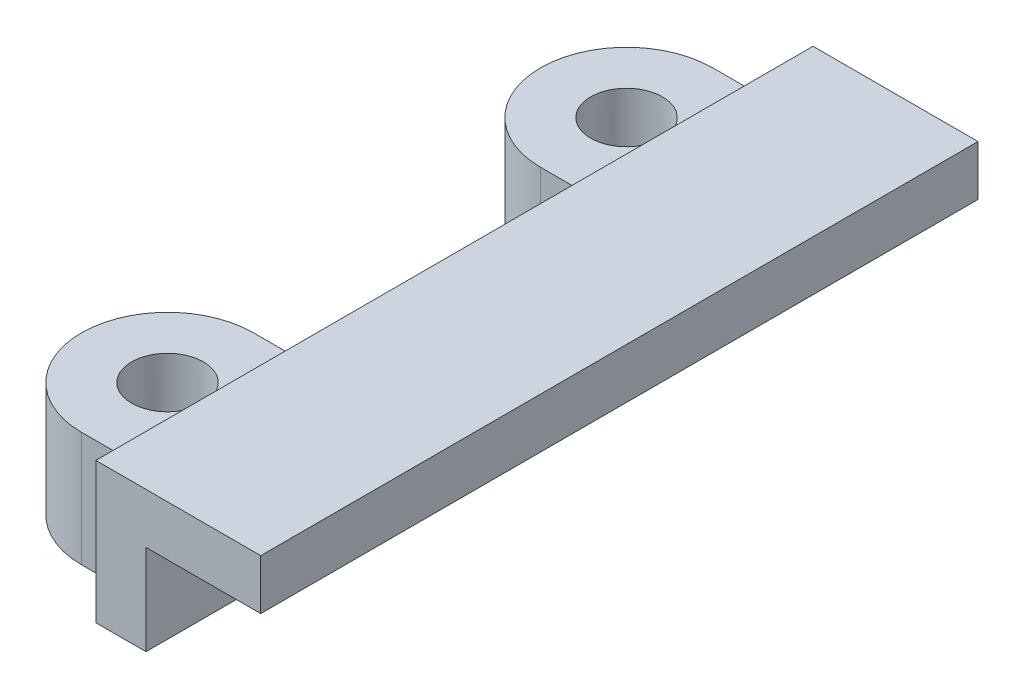
ISO-10303-21;
HEADER;
FILE_DESCRIPTION(('STEP AP214'),'2;1');
FILE_NAME('part.step','',(''),(''),'','','');
FILE_SCHEMA(('AUTOMOTIVE_DESIGN { 1 0 10303 214 1 1 1 1 }'));
ENDSEC;
DATA;
#1=APPLICATION_CONTEXT('core data for automotive mechanical design processes');
#2=APPLICATION_PROTOCOL_DEFINITION('international standard','automotive_design',2000,#1);
#3=PRODUCT_CONTEXT('',#1,'mechanical');
#4=PRODUCT('Part','Part','',(#3));
#5=PRODUCT_RELATED_PRODUCT_CATEGORY('part','',(#4));
#6=PRODUCT_DEFINITION_FORMATION('','',#4);
#7=PRODUCT_DEFINITION_CONTEXT('part definition',#1,'design');
#8=PRODUCT_DEFINITION('design','',#6,#7);
#9=PRODUCT_DEFINITION_SHAPE('','',#8);
#10=(LENGTH_UNIT() NAMED_UNIT(*) SI_UNIT(.MILLI.,.METRE.));
#11=(NAMED_UNIT(*) PLANE_ANGLE_UNIT() SI_UNIT($,.RADIAN.));
#12=(NAMED_UNIT(*) SI_UNIT($,.STERADIAN.) SOLID_ANGLE_UNIT());
#13=UNCERTAINTY_MEASURE_WITH_UNIT(LENGTH_MEASURE(1.E-05),#10,'distance_accuracy_value','');
#14=(GEOMETRIC_REPRESENTATION_CONTEXT(3) GLOBAL_UNCERTAINTY_ASSIGNED_CONTEXT((#13)) GLOBAL_UNIT_ASSIGNED_CONTEXT((#10,
#11,#12)) REPRESENTATION_CONTEXT('',''));
#15=CARTESIAN_POINT('',(0.,0.,0.));
#16=DIRECTION('',(0.,0.,1.));
#17=DIRECTION('',(1.,0.,0.));
#18=AXIS2_PLACEMENT_3D('',#15,#16,#17);
#19=CARTESIAN_POINT('',(161.,9.8,50.));
#20=DIRECTION('',(0.,0.,1.));
#21=DIRECTION('',(1.,0.,0.));
#22=AXIS2_PLACEMENT_3D('',#19,#20,#21);
#23=PLANE('',#22);
#24=DIRECTION('',(0.,1.,0.));
#25=VECTOR('',#24,1.);
#26=CARTESIAN_POINT('',(3.5,0.,50.));
#27=LINE('',#26,#25);
#28=CARTESIAN_POINT('',(3.5,0.,50.));
#29=VERTEX_POINT('',#28);
#30=CARTESIAN_POINT('',(3.5,6.3,50.));
#31=VERTEX_POINT('',#30);
#32=EDGE_CURVE('E170',#29,#31,#27,.T.);
#33=ORIENTED_EDGE('',*,*,#32,.T.);
#34=DIRECTION('',(1.,0.,0.));
#35=VECTOR('',#34,1.);
#36=CARTESIAN_POINT('',(3.5,6.3,50.));
#37=LINE('',#36,#35);
#38=CARTESIAN_POINT('',(11.5,6.3,50.));
#39=VERTEX_POINT('',#38);
#40=EDGE_CURVE('E151',#31,#39,#37,.T.);
#41=ORIENTED_EDGE('',*,*,#40,.T.);
#42=DIRECTION('',(0.,1.,0.));
#43=VECTOR('',#42,1.);
#44=CARTESIAN_POINT('',(11.5,9.8,50.));
#45=LINE('',#44,#43);
#46=CARTESIAN_POINT('',(11.5,9.8,50.));
#47=VERTEX_POINT('',#46);
#48=EDGE_CURVE('E161',#39,#47,#45,.T.);
#49=ORIENTED_EDGE('',*,*,#48,.T.);
#50=DIRECTION('',(-1.,0.,0.));
#51=VECTOR('',#50,1.);
#52=CARTESIAN_POINT('',(161.,9.8,50.));
#53=LINE('',#52,#51);
#54=CARTESIAN_POINT('',(0.,9.8,50.));
#55=VERTEX_POINT('',#54);
#56=EDGE_CURVE('E238',#47,#55,#53,.T.);
#57=ORIENTED_EDGE('',*,*,#56,.T.);
#58=DIRECTION('',(0.,1.,0.));
#59=VECTOR('',#58,1.);
#60=CARTESIAN_POINT('',(0.,9.8,50.));
#61=LINE('',#60,#59);
#62=CARTESIAN_POINT('',(0.,0.,50.));
#63=VERTEX_POINT('',#62);
#64=EDGE_CURVE('E226',#63,#55,#61,.T.);
#65=ORIENTED_EDGE('',*,*,#64,.F.);
#66=DIRECTION('',(-1.,0.,0.));
#67=VECTOR('',#66,1.);
#68=CARTESIAN_POINT('',(161.,0.,50.));
#69=LINE('',#68,#67);
#70=EDGE_CURVE('E240',#29,#63,#69,.T.);
#71=ORIENTED_EDGE('',*,*,#70,.F.);
#72=EDGE_LOOP('',(#33,#41,#49,#57,#65,#71));
#73=FACE_BOUND('',#72,.T.);
#74=ADVANCED_FACE('F43',(#73),#23,.T.);
#75=CARTESIAN_POINT('',(11.5,9.8,0.));
#76=DIRECTION('',(1.,0.,0.));
#77=DIRECTION('',(0.,0.,-1.));
#78=AXIS2_PLACEMENT_3D('',#75,#76,#77);
#79=PLANE('',#78);
#80=ORIENTED_EDGE('',*,*,#48,.F.);
#81=DIRECTION('',(0.,0.,1.));
#82=VECTOR('',#81,1.);
#83=CARTESIAN_POINT('',(11.5,6.3,0.));
#84=LINE('',#83,#82);
#85=CARTESIAN_POINT('',(11.5,6.3,0.));
#86=VERTEX_POINT('',#85);
#87=EDGE_CURVE('E148',#86,#39,#84,.T.);
#88=ORIENTED_EDGE('',*,*,#87,.F.);
#89=DIRECTION('',(0.,1.,0.));
#90=VECTOR('',#89,1.);
#91=CARTESIAN_POINT('',(11.5,9.8,0.));
#92=LINE('',#91,#90);
#93=CARTESIAN_POINT('',(11.5,9.8,0.));
#94=VERTEX_POINT('',#93);
#95=EDGE_CURVE('E241',#86,#94,#92,.T.);
#96=ORIENTED_EDGE('',*,*,#95,.T.);
#97=DIRECTION('',(0.,0.,1.));
#98=VECTOR('',#97,1.);
#99=CARTESIAN_POINT('',(11.5,9.8,0.));
#100=LINE('',#99,#98);
#101=EDGE_CURVE('E159',#94,#47,#100,.T.);
#102=ORIENTED_EDGE('',*,*,#101,.T.);
#103=EDGE_LOOP('',(#80,#88,#96,#102));
#104=FACE_BOUND('',#103,.T.);
#105=ADVANCED_FACE('F169',(#104),#79,.T.);
#106=CARTESIAN_POINT('',(11.5,6.3,0.));
#107=DIRECTION('',(0.,-1.,0.));
#108=DIRECTION('',(1.,0.,0.));
#109=AXIS2_PLACEMENT_3D('',#106,#107,#108);
#110=PLANE('',#109);
#111=ORIENTED_EDGE('',*,*,#87,.T.);
#112=ORIENTED_EDGE('',*,*,#40,.F.);
#113=DIRECTION('',(0.,0.,1.));
#114=VECTOR('',#113,1.);
#115=CARTESIAN_POINT('',(3.5,6.3,0.));
#116=LINE('',#115,#114);
#117=CARTESIAN_POINT('',(3.5,6.3,0.));
#118=VERTEX_POINT('',#117);
#119=EDGE_CURVE('E157',#118,#31,#116,.T.);
#120=ORIENTED_EDGE('',*,*,#119,.F.);
#121=DIRECTION('',(1.,0.,0.));
#122=VECTOR('',#121,1.);
#123=CARTESIAN_POINT('',(11.5,6.3,0.));
#124=LINE('',#123,#122);
#125=EDGE_CURVE('E154',#118,#86,#124,.T.);
#126=ORIENTED_EDGE('',*,*,#125,.T.);
#127=EDGE_LOOP('',(#111,#112,#120,#126));
#128=FACE_BOUND('',#127,.T.);
#129=ADVANCED_FACE('F153',(#128),#110,.T.);
#130=CARTESIAN_POINT('',(0.,9.8,0.));
#131=DIRECTION('',(0.,1.,0.));
#132=DIRECTION('',(0.,0.,1.));
#133=AXIS2_PLACEMENT_3D('',#130,#131,#132);
#134=PLANE('',#133);
#135=ORIENTED_EDGE('',*,*,#56,.F.);
#136=ORIENTED_EDGE('',*,*,#101,.F.);
#137=DIRECTION('',(-1.,0.,0.));
#138=VECTOR('',#137,1.);
#139=CARTESIAN_POINT('',(0.,9.8,0.));
#140=LINE('',#139,#138);
#141=CARTESIAN_POINT('',(0.,9.8,0.));
#142=VERTEX_POINT('',#141);
#143=EDGE_CURVE('E246',#94,#142,#140,.T.);
#144=ORIENTED_EDGE('',*,*,#143,.T.);
#145=DIRECTION('',(0.,0.,1.));
#146=VECTOR('',#145,1.);
#147=CARTESIAN_POINT('',(0.,9.8,0.));
#148=LINE('',#147,#146);
#149=EDGE_CURVE('E247',#142,#55,#148,.T.);
#150=ORIENTED_EDGE('',*,*,#149,.T.);
#151=EDGE_LOOP('',(#135,#136,#144,#150));
#152=FACE_BOUND('',#151,.T.);
#153=ADVANCED_FACE('F297',(#152),#134,.T.);
#154=CARTESIAN_POINT('',(3.5,0.,0.));
#155=DIRECTION('',(0.,-1.,0.));
#156=DIRECTION('',(1.,0.,0.));
#157=AXIS2_PLACEMENT_3D('',#154,#155,#156);
#158=PLANE('',#157);
#159=DIRECTION('',(0.,0.,1.));
#160=VECTOR('',#159,1.);
#161=CARTESIAN_POINT('',(3.5,0.,0.));
#162=LINE('',#161,#160);
#163=CARTESIAN_POINT('',(3.5,0.,0.));
#164=VERTEX_POINT('',#163);
#165=EDGE_CURVE('E11',#164,#29,#162,.T.);
#166=ORIENTED_EDGE('',*,*,#165,.T.);
#167=ORIENTED_EDGE('',*,*,#70,.T.);
#168=DIRECTION('',(0.,0.,1.));
#169=VECTOR('',#168,1.);
#170=CARTESIAN_POINT('',(0.,0.,0.));
#171=LINE('',#170,#169);
#172=CARTESIAN_POINT('',(0.,0.,47.));
#173=VERTEX_POINT('',#172);
#174=EDGE_CURVE('E251',#173,#63,#171,.T.);
#175=ORIENTED_EDGE('',*,*,#174,.F.);
#176=DIRECTION('',(1.,0.,0.));
#177=VECTOR('',#176,1.);
#178=CARTESIAN_POINT('',(0.,0.,47.));
#179=LINE('',#178,#177);
#180=CARTESIAN_POINT('',(-4.,0.,47.));
#181=VERTEX_POINT('',#180);
#182=EDGE_CURVE('E66',#181,#173,#179,.T.);
#183=ORIENTED_EDGE('',*,*,#182,.F.);
#184=CARTESIAN_POINT('',(-4.,0.,41.));
#185=DIRECTION('',(0.,1.,0.));
#186=DIRECTION('',(-1.,0.,0.));
#187=AXIS2_PLACEMENT_3D('',#184,#185,#186);
#188=CIRCLE('',#187,6.);
#189=CARTESIAN_POINT('',(-4.,0.,35.));
#190=VERTEX_POINT('',#189);
#191=EDGE_CURVE('E225',#190,#181,#188,.T.);
#192=ORIENTED_EDGE('',*,*,#191,.F.);
#193=DIRECTION('',(-1.,0.,0.));
#194=VECTOR('',#193,1.);
#195=CARTESIAN_POINT('',(0.,0.,35.));
#196=LINE('',#195,#194);
#197=CARTESIAN_POINT('',(0.,0.,35.));
#198=VERTEX_POINT('',#197);
#199=EDGE_CURVE('E213',#198,#190,#196,.T.);
#200=ORIENTED_EDGE('',*,*,#199,.F.);
#201=CARTESIAN_POINT('',(0.,0.,15.0000000000002));
#202=VERTEX_POINT('',#201);
#203=EDGE_CURVE('E259',#202,#198,#171,.T.);
#204=ORIENTED_EDGE('',*,*,#203,.F.);
#205=DIRECTION('',(-1.,0.,0.));
#206=VECTOR('',#205,1.);
#207=CARTESIAN_POINT('',(0.,0.,15.0000000000002));
#208=LINE('',#207,#206);
#209=CARTESIAN_POINT('',(-3.99999999999998,0.,15.0000000000002));
#210=VERTEX_POINT('',#209);
#211=EDGE_CURVE('E188',#202,#210,#208,.T.);
#212=ORIENTED_EDGE('',*,*,#211,.T.);
#213=CARTESIAN_POINT('',(-3.99999999999998,0.,9.00000000000017));
#214=DIRECTION('',(0.,-1.,0.));
#215=DIRECTION('',(-1.,0.,0.));
#216=AXIS2_PLACEMENT_3D('',#213,#214,#215);
#217=CIRCLE('',#216,6.);
#218=CARTESIAN_POINT('',(-3.99999999999995,0.,3.00000000000017));
#219=VERTEX_POINT('',#218);
#220=EDGE_CURVE('E192',#210,#219,#217,.T.);
#221=ORIENTED_EDGE('',*,*,#220,.T.);
#222=DIRECTION('',(1.,0.,0.));
#223=VECTOR('',#222,1.);
#224=CARTESIAN_POINT('',(0.,0.,3.00000000000018));
#225=LINE('',#224,#223);
#226=CARTESIAN_POINT('',(0.,0.,3.00000000000018));
#227=VERTEX_POINT('',#226);
#228=EDGE_CURVE('E181',#219,#227,#225,.T.);
#229=ORIENTED_EDGE('',*,*,#228,.T.);
#230=CARTESIAN_POINT('',(0.,0.,0.));
#231=VERTEX_POINT('',#230);
#232=EDGE_CURVE('E55',#231,#227,#171,.T.);
#233=ORIENTED_EDGE('',*,*,#232,.F.);
#234=DIRECTION('',(1.,0.,0.));
#235=VECTOR('',#234,1.);
#236=CARTESIAN_POINT('',(3.5,0.,0.));
#237=LINE('',#236,#235);
#238=EDGE_CURVE('E260',#231,#164,#237,.T.);
#239=ORIENTED_EDGE('',*,*,#238,.T.);
#240=EDGE_LOOP('',(#166,#167,#175,#183,#192,#200,#204,#212,#221,#229,#233,#239));
#241=FACE_BOUND('',#240,.T.);
#242=CARTESIAN_POINT('',(-4.,0.,41.));
#243=DIRECTION('',(0.,1.,0.));
#244=DIRECTION('',(-1.,0.,0.));
#245=AXIS2_PLACEMENT_3D('',#242,#243,#244);
#246=CIRCLE('',#245,2.5);
#247=CARTESIAN_POINT('',(-6.5,0.,41.));
#248=VERTEX_POINT('',#247);
#249=EDGE_CURVE('E199',#248,#248,#246,.T.);
#250=ORIENTED_EDGE('',*,*,#249,.T.);
#251=EDGE_LOOP('',(#250));
#252=FACE_BOUND('',#251,.T.);
#253=CARTESIAN_POINT('',(-3.99999999999998,0.,9.00000000000017));
#254=DIRECTION('',(0.,-1.,0.));
#255=DIRECTION('',(-1.,0.,0.));
#256=AXIS2_PLACEMENT_3D('',#253,#254,#255);
#257=CIRCLE('',#256,2.5);
#258=CARTESIAN_POINT('',(-6.49999999999997,0.,9.00000000000016));
#259=VERTEX_POINT('',#258);
#260=EDGE_CURVE('E175',#259,#259,#257,.T.);
#261=ORIENTED_EDGE('',*,*,#260,.F.);
#262=EDGE_LOOP('',(#261));
#263=FACE_BOUND('',#262,.T.);
#264=ADVANCED_FACE('F295',(#241,#252,#263),#158,.T.);
#265=CARTESIAN_POINT('',(0.,0.,0.));
#266=DIRECTION('',(0.,0.,-1.));
#267=DIRECTION('',(-1.,0.,0.));
#268=AXIS2_PLACEMENT_3D('',#265,#266,#267);
#269=PLANE('',#268);
#270=ORIENTED_EDGE('',*,*,#238,.F.);
#271=DIRECTION('',(0.,-1.,0.));
#272=VECTOR('',#271,1.);
#273=CARTESIAN_POINT('',(0.,0.,0.));
#274=LINE('',#273,#272);
#275=EDGE_CURVE('E252',#142,#231,#274,.T.);
#276=ORIENTED_EDGE('',*,*,#275,.F.);
#277=ORIENTED_EDGE('',*,*,#143,.F.);
#278=ORIENTED_EDGE('',*,*,#95,.F.);
#279=ORIENTED_EDGE('',*,*,#125,.F.);
#280=DIRECTION('',(0.,1.,0.));
#281=VECTOR('',#280,1.);
#282=CARTESIAN_POINT('',(3.5,6.3,0.));
#283=LINE('',#282,#281);
#284=EDGE_CURVE('E242',#164,#118,#283,.T.);
#285=ORIENTED_EDGE('',*,*,#284,.F.);
#286=EDGE_LOOP('',(#270,#276,#277,#278,#279,#285));
#287=FACE_BOUND('',#286,.T.);
#288=ADVANCED_FACE('F44',(#287),#269,.T.);
#289=CARTESIAN_POINT('',(0.,0.,0.));
#290=DIRECTION('',(-1.,0.,0.));
#291=DIRECTION('',(0.,0.,1.));
#292=AXIS2_PLACEMENT_3D('',#289,#290,#291);
#293=PLANE('',#292);
#294=DIRECTION('',(0.,-1.,0.));
#295=VECTOR('',#294,1.);
#296=CARTESIAN_POINT('',(0.,8.,3.00000000000018));
#297=LINE('',#296,#295);
#298=CARTESIAN_POINT('',(0.,8.,3.00000000000018));
#299=VERTEX_POINT('',#298);
#300=EDGE_CURVE('E196',#299,#227,#297,.T.);
#301=ORIENTED_EDGE('',*,*,#300,.F.);
#302=DIRECTION('',(0.,0.,1.));
#303=VECTOR('',#302,1.);
#304=CARTESIAN_POINT('',(0.,8.,3.00000000000018));
#305=LINE('',#304,#303);
#306=CARTESIAN_POINT('',(0.,8.,15.0000000000002));
#307=VERTEX_POINT('',#306);
#308=EDGE_CURVE('E178',#299,#307,#305,.T.);
#309=ORIENTED_EDGE('',*,*,#308,.T.);
#310=DIRECTION('',(0.,-1.,0.));
#311=VECTOR('',#310,1.);
#312=CARTESIAN_POINT('',(0.,8.,15.0000000000002));
#313=LINE('',#312,#311);
#314=EDGE_CURVE('E186',#307,#202,#313,.T.);
#315=ORIENTED_EDGE('',*,*,#314,.T.);
#316=ORIENTED_EDGE('',*,*,#203,.T.);
#317=DIRECTION('',(0.,-1.,0.));
#318=VECTOR('',#317,1.);
#319=CARTESIAN_POINT('',(0.,8.,35.));
#320=LINE('',#319,#318);
#321=CARTESIAN_POINT('',(0.,8.,35.));
#322=VERTEX_POINT('',#321);
#323=EDGE_CURVE('E222',#322,#198,#320,.T.);
#324=ORIENTED_EDGE('',*,*,#323,.F.);
#325=DIRECTION('',(0.,0.,-1.));
#326=VECTOR('',#325,1.);
#327=CARTESIAN_POINT('',(0.,8.,47.));
#328=LINE('',#327,#326);
#329=CARTESIAN_POINT('',(0.,8.,47.));
#330=VERTEX_POINT('',#329);
#331=EDGE_CURVE('E208',#330,#322,#328,.T.);
#332=ORIENTED_EDGE('',*,*,#331,.F.);
#333=DIRECTION('',(0.,-1.,0.));
#334=VECTOR('',#333,1.);
#335=CARTESIAN_POINT('',(0.,8.,47.));
#336=LINE('',#335,#334);
#337=EDGE_CURVE('E219',#330,#173,#336,.T.);
#338=ORIENTED_EDGE('',*,*,#337,.T.);
#339=ORIENTED_EDGE('',*,*,#174,.T.);
#340=ORIENTED_EDGE('',*,*,#64,.T.);
#341=ORIENTED_EDGE('',*,*,#149,.F.);
#342=ORIENTED_EDGE('',*,*,#275,.T.);
#343=ORIENTED_EDGE('',*,*,#232,.T.);
#344=EDGE_LOOP('',(#301,#309,#315,#316,#324,#332,#338,#339,#340,#341,#342,#343));
#345=FACE_BOUND('',#344,.T.);
#346=ADVANCED_FACE('F279',(#345),#293,.T.);
#347=CARTESIAN_POINT('',(3.5,6.3,0.));
#348=DIRECTION('',(1.,0.,0.));
#349=DIRECTION('',(0.,1.,0.));
#350=AXIS2_PLACEMENT_3D('',#347,#348,#349);
#351=PLANE('',#350);
#352=ORIENTED_EDGE('',*,*,#119,.T.);
#353=ORIENTED_EDGE('',*,*,#32,.F.);
#354=ORIENTED_EDGE('',*,*,#165,.F.);
#355=ORIENTED_EDGE('',*,*,#284,.T.);
#356=EDGE_LOOP('',(#352,#353,#354,#355));
#357=FACE_BOUND('',#356,.T.);
#358=ADVANCED_FACE('F303',(#357),#351,.T.);
#359=CARTESIAN_POINT('',(0.,8.,35.));
#360=DIRECTION('',(0.,0.,1.));
#361=DIRECTION('',(1.,0.,0.));
#362=AXIS2_PLACEMENT_3D('',#359,#360,#361);
#363=PLANE('',#362);
#364=ORIENTED_EDGE('',*,*,#199,.T.);
#365=DIRECTION('',(0.,-1.,0.));
#366=VECTOR('',#365,1.);
#367=CARTESIAN_POINT('',(-4.,8.,35.));
#368=LINE('',#367,#366);
#369=CARTESIAN_POINT('',(-4.,8.,35.));
#370=VERTEX_POINT('',#369);
#371=EDGE_CURVE('E230',#370,#190,#368,.T.);
#372=ORIENTED_EDGE('',*,*,#371,.F.);
#373=DIRECTION('',(-1.,0.,0.));
#374=VECTOR('',#373,1.);
#375=CARTESIAN_POINT('',(0.,8.,35.));
#376=LINE('',#375,#374);
#377=EDGE_CURVE('E216',#322,#370,#376,.T.);
#378=ORIENTED_EDGE('',*,*,#377,.F.);
#379=ORIENTED_EDGE('',*,*,#323,.T.);
#380=EDGE_LOOP('',(#364,#372,#378,#379));
#381=FACE_BOUND('',#380,.T.);
#382=ADVANCED_FACE('F282',(#381),#363,.F.);
#383=CARTESIAN_POINT('',(-4.,8.,41.));
#384=DIRECTION('',(0.,-1.,0.));
#385=DIRECTION('',(1.,0.,0.));
#386=AXIS2_PLACEMENT_3D('',#383,#384,#385);
#387=CYLINDRICAL_SURFACE('',#386,6.);
#388=ORIENTED_EDGE('',*,*,#191,.T.);
#389=DIRECTION('',(0.,-1.,0.));
#390=VECTOR('',#389,1.);
#391=CARTESIAN_POINT('',(-4.,8.,47.));
#392=LINE('',#391,#390);
#393=CARTESIAN_POINT('',(-4.,8.,47.));
#394=VERTEX_POINT('',#393);
#395=EDGE_CURVE('E235',#394,#181,#392,.T.);
#396=ORIENTED_EDGE('',*,*,#395,.F.);
#397=CARTESIAN_POINT('',(-4.,8.,41.));
#398=DIRECTION('',(0.,1.,0.));
#399=DIRECTION('',(-1.,0.,0.));
#400=AXIS2_PLACEMENT_3D('',#397,#398,#399);
#401=CIRCLE('',#400,6.);
#402=EDGE_CURVE('E218',#370,#394,#401,.T.);
#403=ORIENTED_EDGE('',*,*,#402,.F.);
#404=ORIENTED_EDGE('',*,*,#371,.T.);
#405=EDGE_LOOP('',(#388,#396,#403,#404));
#406=FACE_BOUND('',#405,.T.);
#407=ADVANCED_FACE('F289',(#406),#387,.T.);
#408=CARTESIAN_POINT('',(0.,8.,47.));
#409=DIRECTION('',(0.,0.,-1.));
#410=DIRECTION('',(-1.,0.,0.));
#411=AXIS2_PLACEMENT_3D('',#408,#409,#410);
#412=PLANE('',#411);
#413=ORIENTED_EDGE('',*,*,#182,.T.);
#414=ORIENTED_EDGE('',*,*,#337,.F.);
#415=DIRECTION('',(1.,0.,0.));
#416=VECTOR('',#415,1.);
#417=CARTESIAN_POINT('',(0.,8.,47.));
#418=LINE('',#417,#416);
#419=EDGE_CURVE('E212',#394,#330,#418,.T.);
#420=ORIENTED_EDGE('',*,*,#419,.F.);
#421=ORIENTED_EDGE('',*,*,#395,.T.);
#422=EDGE_LOOP('',(#413,#414,#420,#421));
#423=FACE_BOUND('',#422,.T.);
#424=ADVANCED_FACE('F275',(#423),#412,.F.);
#425=CARTESIAN_POINT('',(-4.,8.,41.));
#426=DIRECTION('',(0.,-1.,0.));
#427=DIRECTION('',(-1.,0.,0.));
#428=AXIS2_PLACEMENT_3D('',#425,#426,#427);
#429=PLANE('',#428);
#430=CARTESIAN_POINT('',(-4.,8.,41.));
#431=DIRECTION('',(0.,-1.,0.));
#432=DIRECTION('',(1.,0.,0.));
#433=AXIS2_PLACEMENT_3D('',#430,#431,#432);
#434=CIRCLE('',#433,2.5);
#435=CARTESIAN_POINT('',(-1.50000000000001,8.,41.));
#436=VERTEX_POINT('',#435);
#437=EDGE_CURVE('E209',#436,#436,#434,.F.);
#438=ORIENTED_EDGE('',*,*,#437,.F.);
#439=EDGE_LOOP('',(#438));
#440=FACE_BOUND('',#439,.T.);
#441=ORIENTED_EDGE('',*,*,#331,.T.);
#442=ORIENTED_EDGE('',*,*,#377,.T.);
#443=ORIENTED_EDGE('',*,*,#402,.T.);
#444=ORIENTED_EDGE('',*,*,#419,.T.);
#445=EDGE_LOOP('',(#441,#442,#443,#444));
#446=FACE_BOUND('',#445,.T.);
#447=ADVANCED_FACE('F269',(#440,#446),#429,.F.);
#448=CARTESIAN_POINT('',(-4.,9.8,41.));
#449=DIRECTION('',(0.,-1.,0.));
#450=DIRECTION('',(1.,0.,0.));
#451=AXIS2_PLACEMENT_3D('',#448,#449,#450);
#452=CYLINDRICAL_SURFACE('',#451,2.5);
#453=ORIENTED_EDGE('',*,*,#249,.F.);
#454=EDGE_LOOP('',(#453));
#455=FACE_BOUND('',#454,.T.);
#456=ORIENTED_EDGE('',*,*,#437,.T.);
#457=EDGE_LOOP('',(#456));
#458=FACE_BOUND('',#457,.T.);
#459=ADVANCED_FACE('F270',(#455,#458),#452,.F.);
#460=CARTESIAN_POINT('',(0.,8.,3.00000000000018));
#461=DIRECTION('',(0.,0.,-1.));
#462=DIRECTION('',(-1.,0.,0.));
#463=AXIS2_PLACEMENT_3D('',#460,#461,#462);
#464=PLANE('',#463);
#465=ORIENTED_EDGE('',*,*,#228,.F.);
#466=DIRECTION('',(0.,-1.,0.));
#467=VECTOR('',#466,1.);
#468=CARTESIAN_POINT('',(-3.99999999999995,8.,3.00000000000017));
#469=LINE('',#468,#467);
#470=CARTESIAN_POINT('',(-3.99999999999995,8.,3.00000000000017));
#471=VERTEX_POINT('',#470);
#472=EDGE_CURVE('E203',#471,#219,#469,.T.);
#473=ORIENTED_EDGE('',*,*,#472,.F.);
#474=DIRECTION('',(1.,0.,0.));
#475=VECTOR('',#474,1.);
#476=CARTESIAN_POINT('',(0.,8.,3.00000000000018));
#477=LINE('',#476,#475);
#478=EDGE_CURVE('E187',#471,#299,#477,.T.);
#479=ORIENTED_EDGE('',*,*,#478,.T.);
#480=ORIENTED_EDGE('',*,*,#300,.T.);
#481=EDGE_LOOP('',(#465,#473,#479,#480));
#482=FACE_BOUND('',#481,.T.);
#483=ADVANCED_FACE('F364',(#482),#464,.T.);
#484=CARTESIAN_POINT('',(-3.99999999999998,8.,9.00000000000017));
#485=DIRECTION('',(0.,-1.,0.));
#486=DIRECTION('',(1.,0.,0.));
#487=AXIS2_PLACEMENT_3D('',#484,#485,#486);
#488=CYLINDRICAL_SURFACE('',#487,6.);
#489=ORIENTED_EDGE('',*,*,#220,.F.);
#490=DIRECTION('',(0.,-1.,0.));
#491=VECTOR('',#490,1.);
#492=CARTESIAN_POINT('',(-3.99999999999998,8.,15.0000000000002));
#493=LINE('',#492,#491);
#494=CARTESIAN_POINT('',(-3.99999999999998,8.,15.0000000000002));
#495=VERTEX_POINT('',#494);
#496=EDGE_CURVE('E201',#495,#210,#493,.T.);
#497=ORIENTED_EDGE('',*,*,#496,.F.);
#498=CARTESIAN_POINT('',(-3.99999999999998,8.,9.00000000000017));
#499=DIRECTION('',(0.,-1.,0.));
#500=DIRECTION('',(-1.,0.,0.));
#501=AXIS2_PLACEMENT_3D('',#498,#499,#500);
#502=CIRCLE('',#501,6.);
#503=EDGE_CURVE('E182',#495,#471,#502,.T.);
#504=ORIENTED_EDGE('',*,*,#503,.T.);
#505=ORIENTED_EDGE('',*,*,#472,.T.);
#506=EDGE_LOOP('',(#489,#497,#504,#505));
#507=FACE_BOUND('',#506,.T.);
#508=ADVANCED_FACE('F352',(#507),#488,.T.);
#509=CARTESIAN_POINT('',(0.,8.,15.0000000000002));
#510=DIRECTION('',(0.,0.,1.));
#511=DIRECTION('',(1.,0.,0.));
#512=AXIS2_PLACEMENT_3D('',#509,#510,#511);
#513=PLANE('',#512);
#514=ORIENTED_EDGE('',*,*,#211,.F.);
#515=ORIENTED_EDGE('',*,*,#314,.F.);
#516=DIRECTION('',(-1.,0.,0.));
#517=VECTOR('',#516,1.);
#518=CARTESIAN_POINT('',(0.,8.,15.0000000000002));
#519=LINE('',#518,#517);
#520=EDGE_CURVE('E58',#307,#495,#519,.T.);
#521=ORIENTED_EDGE('',*,*,#520,.T.);
#522=ORIENTED_EDGE('',*,*,#496,.T.);
#523=EDGE_LOOP('',(#514,#515,#521,#522));
#524=FACE_BOUND('',#523,.T.);
#525=ADVANCED_FACE('F348',(#524),#513,.T.);
#526=CARTESIAN_POINT('',(-3.99999999999998,8.,9.00000000000017));
#527=DIRECTION('',(0.,-1.,0.));
#528=DIRECTION('',(-1.,0.,0.));
#529=AXIS2_PLACEMENT_3D('',#526,#527,#528);
#530=PLANE('',#529);
#531=CARTESIAN_POINT('',(-3.99999999999998,8.,9.00000000000017));
#532=DIRECTION('',(0.,-1.,0.));
#533=DIRECTION('',(1.,0.,0.));
#534=AXIS2_PLACEMENT_3D('',#531,#532,#533);
#535=CIRCLE('',#534,2.5);
#536=CARTESIAN_POINT('',(-1.49999999999998,8.,9.00000000000017));
#537=VERTEX_POINT('',#536);
#538=EDGE_CURVE('E50',#537,#537,#535,.T.);
#539=ORIENTED_EDGE('',*,*,#538,.T.);
#540=EDGE_LOOP('',(#539));
#541=FACE_BOUND('',#540,.T.);
#542=ORIENTED_EDGE('',*,*,#308,.F.);
#543=ORIENTED_EDGE('',*,*,#478,.F.);
#544=ORIENTED_EDGE('',*,*,#503,.F.);
#545=ORIENTED_EDGE('',*,*,#520,.F.);
#546=EDGE_LOOP('',(#542,#543,#544,#545));
#547=FACE_BOUND('',#546,.T.);
#548=ADVANCED_FACE('F337',(#541,#547),#530,.F.);
#549=CARTESIAN_POINT('',(-3.99999999999998,9.8,9.00000000000017));
#550=DIRECTION('',(0.,-1.,0.));
#551=DIRECTION('',(1.,0.,0.));
#552=AXIS2_PLACEMENT_3D('',#549,#550,#551);
#553=CYLINDRICAL_SURFACE('',#552,2.5);
#554=ORIENTED_EDGE('',*,*,#260,.T.);
#555=EDGE_LOOP('',(#554));
#556=FACE_BOUND('',#555,.T.);
#557=ORIENTED_EDGE('',*,*,#538,.F.);
#558=EDGE_LOOP('',(#557));
#559=FACE_BOUND('',#558,.T.);
#560=ADVANCED_FACE('F335',(#556,#559),#553,.F.);
#561=CLOSED_SHELL('',(#74,#105,#129,#153,#264,#288,#346,#358,#382,#407,#424,#447,#459,#483,#508,
#525,#548,#560));
#562=MANIFOLD_SOLID_BREP('B2',#561);
#563=ADVANCED_BREP_SHAPE_REPRESENTATION('',(#18,#562),#14);
#564=SHAPE_DEFINITION_REPRESENTATION(#9,#563);
ENDSEC;
END-ISO-10303-21;
